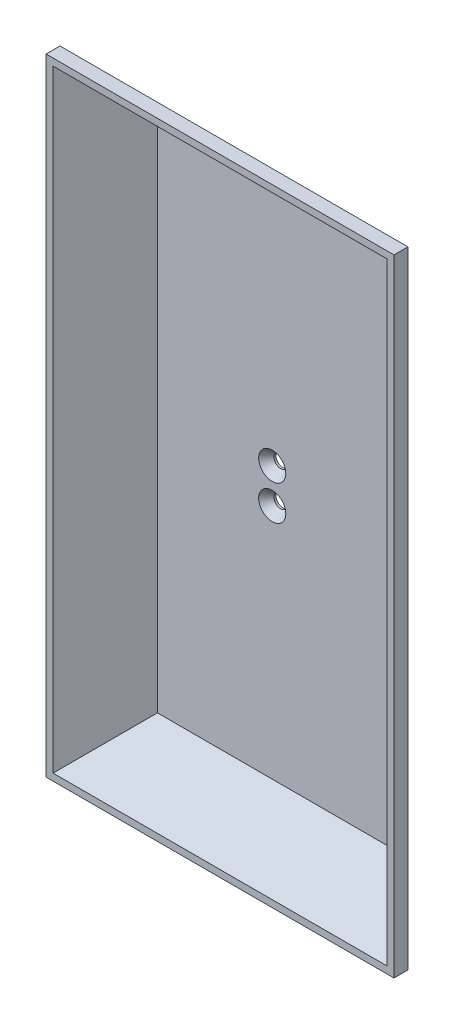
ISO-10303-21;
HEADER;
FILE_DESCRIPTION(('STEP AP214'),'2;1');
FILE_NAME('part.step','',(''),(''),'','','');
FILE_SCHEMA(('AUTOMOTIVE_DESIGN { 1 0 10303 214 1 1 1 1 }'));
ENDSEC;
DATA;
#1=APPLICATION_CONTEXT('core data for automotive mechanical design processes');
#2=APPLICATION_PROTOCOL_DEFINITION('international standard','automotive_design',2000,#1);
#3=PRODUCT_CONTEXT('',#1,'mechanical');
#4=PRODUCT('Part','Part','',(#3));
#5=PRODUCT_RELATED_PRODUCT_CATEGORY('part','',(#4));
#6=PRODUCT_DEFINITION_FORMATION('','',#4);
#7=PRODUCT_DEFINITION_CONTEXT('part definition',#1,'design');
#8=PRODUCT_DEFINITION('design','',#6,#7);
#9=PRODUCT_DEFINITION_SHAPE('','',#8);
#10=(LENGTH_UNIT() NAMED_UNIT(*) SI_UNIT(.MILLI.,.METRE.));
#11=(NAMED_UNIT(*) PLANE_ANGLE_UNIT() SI_UNIT($,.RADIAN.));
#12=(NAMED_UNIT(*) SI_UNIT($,.STERADIAN.) SOLID_ANGLE_UNIT());
#13=UNCERTAINTY_MEASURE_WITH_UNIT(LENGTH_MEASURE(1.E-05),#10,'distance_accuracy_value','');
#14=(GEOMETRIC_REPRESENTATION_CONTEXT(3) GLOBAL_UNCERTAINTY_ASSIGNED_CONTEXT((#13)) GLOBAL_UNIT_ASSIGNED_CONTEXT((#10,
#11,#12)) REPRESENTATION_CONTEXT('',''));
#15=CARTESIAN_POINT('',(0.,0.,0.));
#16=DIRECTION('',(0.,0.,1.));
#17=DIRECTION('',(1.,0.,0.));
#18=AXIS2_PLACEMENT_3D('',#15,#16,#17);
#19=CARTESIAN_POINT('',(0.,-5.,-1.2E-05));
#20=DIRECTION('',(0.,0.,1.));
#21=DIRECTION('',(1.,0.,0.));
#22=AXIS2_PLACEMENT_3D('',#19,#20,#21);
#23=CYLINDRICAL_SURFACE('',#22,1.9);
#24=CARTESIAN_POINT('',(0.,-5.,1.59999999999993));
#25=DIRECTION('',(0.,0.,1.));
#26=DIRECTION('',(1.,0.,0.));
#27=AXIS2_PLACEMENT_3D('',#24,#25,#26);
#28=CIRCLE('',#27,1.9);
#29=CARTESIAN_POINT('',(1.9,-5.,1.59999999999993));
#30=VERTEX_POINT('',#29);
#31=EDGE_CURVE('E11',#30,#30,#28,.T.);
#32=CARTESIAN_POINT('',(0.,-5.,1.));
#33=DIRECTION('',(0.,0.,-1.));
#34=DIRECTION('',(-1.,0.,0.));
#35=AXIS2_PLACEMENT_3D('',#32,#33,#34);
#36=CIRCLE('',#35,1.9);
#37=CARTESIAN_POINT('',(1.9,-5.,1.));
#38=VERTEX_POINT('',#37);
#39=EDGE_CURVE('E181',#38,#38,#36,.F.);
#40=CARTESIAN_POINT('',(1.9,-5.,1.59999999999993));
#41=CARTESIAN_POINT('',(1.9,-5.,1.59374999999993));
#42=CARTESIAN_POINT('',(1.9,-5.,1.58749999999994));
#43=CARTESIAN_POINT('',(1.9,-5.,1.57499999999994));
#44=CARTESIAN_POINT('',(1.9,-5.,1.56874999999994));
#45=CARTESIAN_POINT('',(1.9,-5.,1.55624999999994));
#46=CARTESIAN_POINT('',(1.9,-5.,1.54999999999994));
#47=CARTESIAN_POINT('',(1.9,-5.,1.53749999999994));
#48=CARTESIAN_POINT('',(1.9,-5.,1.53124999999994));
#49=CARTESIAN_POINT('',(1.9,-5.,1.51874999999994));
#50=CARTESIAN_POINT('',(1.9,-5.,1.51249999999994));
#51=CARTESIAN_POINT('',(1.9,-5.,1.49999999999994));
#52=CARTESIAN_POINT('',(1.9,-5.,1.49374999999995));
#53=CARTESIAN_POINT('',(1.9,-5.,1.48124999999995));
#54=CARTESIAN_POINT('',(1.9,-5.,1.47499999999995));
#55=CARTESIAN_POINT('',(1.9,-5.,1.46249999999995));
#56=CARTESIAN_POINT('',(1.9,-5.,1.45624999999995));
#57=CARTESIAN_POINT('',(1.9,-5.,1.44374999999995));
#58=CARTESIAN_POINT('',(1.9,-5.,1.43749999999995));
#59=CARTESIAN_POINT('',(1.9,-5.,1.42499999999995));
#60=CARTESIAN_POINT('',(1.9,-5.,1.41874999999995));
#61=CARTESIAN_POINT('',(1.9,-5.,1.40624999999996));
#62=CARTESIAN_POINT('',(1.9,-5.,1.39999999999996));
#63=CARTESIAN_POINT('',(1.9,-5.,1.38749999999996));
#64=CARTESIAN_POINT('',(1.9,-5.,1.38124999999996));
#65=CARTESIAN_POINT('',(1.9,-5.,1.36874999999996));
#66=CARTESIAN_POINT('',(1.9,-5.,1.36249999999996));
#67=CARTESIAN_POINT('',(1.9,-5.,1.34999999999996));
#68=CARTESIAN_POINT('',(1.9,-5.,1.34374999999996));
#69=CARTESIAN_POINT('',(1.9,-5.,1.33124999999996));
#70=CARTESIAN_POINT('',(1.9,-5.,1.32499999999996));
#71=CARTESIAN_POINT('',(1.9,-5.,1.31249999999997));
#72=CARTESIAN_POINT('',(1.9,-5.,1.30624999999997));
#73=CARTESIAN_POINT('',(1.9,-5.,1.29374999999997));
#74=CARTESIAN_POINT('',(1.9,-5.,1.28749999999997));
#75=CARTESIAN_POINT('',(1.9,-5.,1.27499999999997));
#76=CARTESIAN_POINT('',(1.9,-5.,1.26874999999997));
#77=CARTESIAN_POINT('',(1.9,-5.,1.25624999999997));
#78=CARTESIAN_POINT('',(1.9,-5.,1.24999999999997));
#79=CARTESIAN_POINT('',(1.9,-5.,1.23749999999997));
#80=CARTESIAN_POINT('',(1.9,-5.,1.23124999999997));
#81=CARTESIAN_POINT('',(1.9,-5.,1.21874999999998));
#82=CARTESIAN_POINT('',(1.9,-5.,1.21249999999998));
#83=CARTESIAN_POINT('',(1.9,-5.,1.19999999999998));
#84=CARTESIAN_POINT('',(1.9,-5.,1.19374999999998));
#85=CARTESIAN_POINT('',(1.9,-5.,1.18124999999998));
#86=CARTESIAN_POINT('',(1.9,-5.,1.17499999999998));
#87=CARTESIAN_POINT('',(1.9,-5.,1.16249999999998));
#88=CARTESIAN_POINT('',(1.9,-5.,1.15624999999998));
#89=CARTESIAN_POINT('',(1.9,-5.,1.14374999999998));
#90=CARTESIAN_POINT('',(1.9,-5.,1.13749999999998));
#91=CARTESIAN_POINT('',(1.9,-5.,1.12499999999999));
#92=CARTESIAN_POINT('',(1.9,-5.,1.11874999999999));
#93=CARTESIAN_POINT('',(1.9,-5.,1.10624999999999));
#94=CARTESIAN_POINT('',(1.9,-5.,1.09999999999999));
#95=CARTESIAN_POINT('',(1.9,-5.,1.08749999999999));
#96=CARTESIAN_POINT('',(1.9,-5.,1.08124999999999));
#97=CARTESIAN_POINT('',(1.9,-5.,1.06874999999999));
#98=CARTESIAN_POINT('',(1.9,-5.,1.06249999999999));
#99=CARTESIAN_POINT('',(1.9,-5.,1.04999999999999));
#100=CARTESIAN_POINT('',(1.9,-5.,1.04375));
#101=CARTESIAN_POINT('',(1.9,-5.,1.03125));
#102=CARTESIAN_POINT('',(1.9,-5.,1.025));
#103=CARTESIAN_POINT('',(1.9,-5.,1.0125));
#104=CARTESIAN_POINT('',(1.9,-5.,1.00625));
#105=CARTESIAN_POINT('',(1.9,-5.,1.));
#106=B_SPLINE_CURVE_WITH_KNOTS('',3,(#40,#41,#42,#43,#44,#45,#46,#47,#48,#49,#50,#51,#52,#53,
#54,#55,#56,#57,#58,#59,#60,#61,#62,#63,#64,#65,#66,#67,#68,#69,#70,#71,#72,#73,#74,#75,#76,#77,
#78,#79,#80,#81,#82,#83,#84,#85,#86,#87,#88,#89,#90,#91,#92,#93,#94,#95,#96,#97,#98,#99,#100,
#101,#102,#103,#104,#105),.UNSPECIFIED.,.F.,.F.,(4,2,2,2,2,2,2,2,2,2,2,2,2,2,2,2,2,2,2,2,2,2,2,
2,2,2,2,2,2,2,2,2,4),(0.,0.0187499999999979,0.0374999999999959,0.0562499999999938,
0.0749999999999917,0.0937499999999897,0.112499999999988,0.131249999999986,0.149999999999983,
0.168749999999981,0.187499999999979,0.206249999999977,0.224999999999975,0.243749999999973,
0.262499999999971,0.281249999999969,0.299999999999967,0.318749999999965,0.337499999999963,
0.356249999999961,0.374999999999959,0.393749999999957,0.412499999999955,0.431249999999953,
0.44999999999995,0.468749999999948,0.487499999999946,0.506249999999944,0.524999999999942,
0.54374999999994,0.562499999999938,0.581249999999936,0.599999999999934),.UNSPECIFIED.);
#107=EDGE_CURVE('BSEAM38',#30,#38,#106,.T.);
#108=ORIENTED_EDGE('',*,*,#31,.T.);
#109=ORIENTED_EDGE('',*,*,#39,.F.);
#110=ORIENTED_EDGE('',*,*,#107,.T.);
#111=ORIENTED_EDGE('',*,*,#107,.F.);
#112=EDGE_LOOP('',(#108,#110,#109,#111));
#113=FACE_BOUND('',#112,.T.);
#114=ADVANCED_FACE('F38',(#113),#23,.F.);
#115=CARTESIAN_POINT('',(0.,5.,-1.2E-05));
#116=DIRECTION('',(0.,0.,1.));
#117=DIRECTION('',(1.,0.,0.));
#118=AXIS2_PLACEMENT_3D('',#115,#116,#117);
#119=CYLINDRICAL_SURFACE('',#118,1.9);
#120=CARTESIAN_POINT('',(0.,5.,1.59999999999993));
#121=DIRECTION('',(0.,0.,1.));
#122=DIRECTION('',(1.,0.,0.));
#123=AXIS2_PLACEMENT_3D('',#120,#121,#122);
#124=CIRCLE('',#123,1.9);
#125=CARTESIAN_POINT('',(1.9,5.,1.59999999999993));
#126=VERTEX_POINT('',#125);
#127=EDGE_CURVE('E246',#126,#126,#124,.T.);
#128=CARTESIAN_POINT('',(0.,5.,1.));
#129=DIRECTION('',(0.,0.,-1.));
#130=DIRECTION('',(-1.,0.,0.));
#131=AXIS2_PLACEMENT_3D('',#128,#129,#130);
#132=CIRCLE('',#131,1.9);
#133=CARTESIAN_POINT('',(1.9,5.,1.));
#134=VERTEX_POINT('',#133);
#135=EDGE_CURVE('E43',#134,#134,#132,.F.);
#136=CARTESIAN_POINT('',(1.9,5.,1.59999999999993));
#137=CARTESIAN_POINT('',(1.9,5.,1.59374999999993));
#138=CARTESIAN_POINT('',(1.9,5.,1.58749999999993));
#139=CARTESIAN_POINT('',(1.9,5.,1.57499999999994));
#140=CARTESIAN_POINT('',(1.9,5.,1.56874999999994));
#141=CARTESIAN_POINT('',(1.9,5.,1.55624999999994));
#142=CARTESIAN_POINT('',(1.9,5.,1.54999999999994));
#143=CARTESIAN_POINT('',(1.9,5.,1.53749999999994));
#144=CARTESIAN_POINT('',(1.9,5.,1.53124999999994));
#145=CARTESIAN_POINT('',(1.9,5.,1.51874999999994));
#146=CARTESIAN_POINT('',(1.9,5.,1.51249999999994));
#147=CARTESIAN_POINT('',(1.9,5.,1.49999999999994));
#148=CARTESIAN_POINT('',(1.9,5.,1.49374999999995));
#149=CARTESIAN_POINT('',(1.9,5.,1.48124999999995));
#150=CARTESIAN_POINT('',(1.9,5.,1.47499999999995));
#151=CARTESIAN_POINT('',(1.9,5.,1.46249999999995));
#152=CARTESIAN_POINT('',(1.9,5.,1.45624999999995));
#153=CARTESIAN_POINT('',(1.9,5.,1.44374999999995));
#154=CARTESIAN_POINT('',(1.9,5.,1.43749999999995));
#155=CARTESIAN_POINT('',(1.9,5.,1.42499999999995));
#156=CARTESIAN_POINT('',(1.9,5.,1.41874999999995));
#157=CARTESIAN_POINT('',(1.9,5.,1.40624999999995));
#158=CARTESIAN_POINT('',(1.9,5.,1.39999999999996));
#159=CARTESIAN_POINT('',(1.9,5.,1.38749999999996));
#160=CARTESIAN_POINT('',(1.9,5.,1.38124999999996));
#161=CARTESIAN_POINT('',(1.9,5.,1.36874999999996));
#162=CARTESIAN_POINT('',(1.9,5.,1.36249999999996));
#163=CARTESIAN_POINT('',(1.9,5.,1.34999999999996));
#164=CARTESIAN_POINT('',(1.9,5.,1.34374999999996));
#165=CARTESIAN_POINT('',(1.9,5.,1.33124999999996));
#166=CARTESIAN_POINT('',(1.9,5.,1.32499999999996));
#167=CARTESIAN_POINT('',(1.9,5.,1.31249999999997));
#168=CARTESIAN_POINT('',(1.9,5.,1.30624999999997));
#169=CARTESIAN_POINT('',(1.9,5.,1.29374999999997));
#170=CARTESIAN_POINT('',(1.9,5.,1.28749999999997));
#171=CARTESIAN_POINT('',(1.9,5.,1.27499999999997));
#172=CARTESIAN_POINT('',(1.9,5.,1.26874999999997));
#173=CARTESIAN_POINT('',(1.9,5.,1.25624999999997));
#174=CARTESIAN_POINT('',(1.9,5.,1.24999999999997));
#175=CARTESIAN_POINT('',(1.9,5.,1.23749999999997));
#176=CARTESIAN_POINT('',(1.9,5.,1.23124999999997));
#177=CARTESIAN_POINT('',(1.9,5.,1.21874999999998));
#178=CARTESIAN_POINT('',(1.9,5.,1.21249999999998));
#179=CARTESIAN_POINT('',(1.9,5.,1.19999999999998));
#180=CARTESIAN_POINT('',(1.9,5.,1.19374999999998));
#181=CARTESIAN_POINT('',(1.9,5.,1.18124999999998));
#182=CARTESIAN_POINT('',(1.9,5.,1.17499999999998));
#183=CARTESIAN_POINT('',(1.9,5.,1.16249999999998));
#184=CARTESIAN_POINT('',(1.9,5.,1.15624999999998));
#185=CARTESIAN_POINT('',(1.9,5.,1.14374999999998));
#186=CARTESIAN_POINT('',(1.9,5.,1.13749999999998));
#187=CARTESIAN_POINT('',(1.9,5.,1.12499999999999));
#188=CARTESIAN_POINT('',(1.9,5.,1.11874999999999));
#189=CARTESIAN_POINT('',(1.9,5.,1.10624999999999));
#190=CARTESIAN_POINT('',(1.9,5.,1.09999999999999));
#191=CARTESIAN_POINT('',(1.9,5.,1.08749999999999));
#192=CARTESIAN_POINT('',(1.9,5.,1.08124999999999));
#193=CARTESIAN_POINT('',(1.9,5.,1.06874999999999));
#194=CARTESIAN_POINT('',(1.9,5.,1.06249999999999));
#195=CARTESIAN_POINT('',(1.9,5.,1.04999999999999));
#196=CARTESIAN_POINT('',(1.9,5.,1.04375));
#197=CARTESIAN_POINT('',(1.9,5.,1.03125));
#198=CARTESIAN_POINT('',(1.9,5.,1.025));
#199=CARTESIAN_POINT('',(1.9,5.,1.0125));
#200=CARTESIAN_POINT('',(1.9,5.,1.00625));
#201=CARTESIAN_POINT('',(1.9,5.,1.));
#202=B_SPLINE_CURVE_WITH_KNOTS('',3,(#136,#137,#138,#139,#140,#141,#142,#143,#144,#145,#146,
#147,#148,#149,#150,#151,#152,#153,#154,#155,#156,#157,#158,#159,#160,#161,#162,#163,#164,#165,
#166,#167,#168,#169,#170,#171,#172,#173,#174,#175,#176,#177,#178,#179,#180,#181,#182,#183,#184,
#185,#186,#187,#188,#189,#190,#191,#192,#193,#194,#195,#196,#197,#198,#199,#200,#201),
.UNSPECIFIED.,.F.,.F.,(4,2,2,2,2,2,2,2,2,2,2,2,2,2,2,2,2,2,2,2,2,2,2,2,2,2,2,2,2,2,2,2,4),(0.,
0.0187499999999979,0.0374999999999959,0.0562499999999938,0.0749999999999917,0.0937499999999895,
0.112499999999987,0.131249999999985,0.149999999999983,0.168749999999981,0.187499999999979,
0.206249999999977,0.224999999999975,0.243749999999973,0.262499999999971,0.281249999999969,
0.299999999999967,0.318749999999964,0.337499999999962,0.35624999999996,0.374999999999958,
0.393749999999956,0.412499999999954,0.431249999999952,0.44999999999995,0.468749999999948,
0.487499999999946,0.506249999999943,0.524999999999941,0.543749999999939,0.562499999999937,
0.581249999999935,0.599999999999933),.UNSPECIFIED.);
#203=EDGE_CURVE('BSEAM282',#126,#134,#202,.T.);
#204=ORIENTED_EDGE('',*,*,#127,.T.);
#205=ORIENTED_EDGE('',*,*,#135,.F.);
#206=ORIENTED_EDGE('',*,*,#203,.T.);
#207=ORIENTED_EDGE('',*,*,#203,.F.);
#208=EDGE_LOOP('',(#204,#206,#205,#207));
#209=FACE_BOUND('',#208,.T.);
#210=ADVANCED_FACE('F282',(#209),#119,.F.);
#211=CARTESIAN_POINT('',(50.,90.,4.));
#212=DIRECTION('',(-1.,0.,0.));
#213=DIRECTION('',(0.,-1.,0.));
#214=AXIS2_PLACEMENT_3D('',#211,#212,#213);
#215=PLANE('',#214);
#216=DIRECTION('',(0.,0.,-1.));
#217=VECTOR('',#216,1.);
#218=CARTESIAN_POINT('',(50.,-90.,4.));
#219=LINE('',#218,#217);
#220=CARTESIAN_POINT('',(50.,-90.,19.));
#221=VERTEX_POINT('',#220);
#222=CARTESIAN_POINT('',(50.,-90.,15.));
#223=VERTEX_POINT('',#222);
#224=EDGE_CURVE('E210',#221,#223,#219,.T.);
#225=ORIENTED_EDGE('',*,*,#224,.T.);
#226=DIRECTION('',(0.,1.,0.));
#227=VECTOR('',#226,1.);
#228=CARTESIAN_POINT('',(50.,90.,15.));
#229=LINE('',#228,#227);
#230=CARTESIAN_POINT('',(50.,90.,15.));
#231=VERTEX_POINT('',#230);
#232=EDGE_CURVE('E241',#223,#231,#229,.T.);
#233=ORIENTED_EDGE('',*,*,#232,.T.);
#234=DIRECTION('',(0.,0.,-1.));
#235=VECTOR('',#234,1.);
#236=CARTESIAN_POINT('',(50.,90.,4.));
#237=LINE('',#236,#235);
#238=CARTESIAN_POINT('',(50.,90.,19.));
#239=VERTEX_POINT('',#238);
#240=EDGE_CURVE('E217',#239,#231,#237,.T.);
#241=ORIENTED_EDGE('',*,*,#240,.F.);
#242=DIRECTION('',(0.,1.,0.));
#243=VECTOR('',#242,1.);
#244=CARTESIAN_POINT('',(50.,90.,19.));
#245=LINE('',#244,#243);
#246=EDGE_CURVE('E198',#221,#239,#245,.T.);
#247=ORIENTED_EDGE('',*,*,#246,.F.);
#248=EDGE_LOOP('',(#225,#233,#241,#247));
#249=FACE_BOUND('',#248,.T.);
#250=ADVANCED_FACE('F285',(#249),#215,.F.);
#251=CARTESIAN_POINT('',(-50.,90.,4.));
#252=DIRECTION('',(0.,-1.,0.));
#253=DIRECTION('',(0.,0.,-1.));
#254=AXIS2_PLACEMENT_3D('',#251,#252,#253);
#255=PLANE('',#254);
#256=ORIENTED_EDGE('',*,*,#240,.T.);
#257=DIRECTION('',(-1.,0.,0.));
#258=VECTOR('',#257,1.);
#259=CARTESIAN_POINT('',(-50.,90.,15.));
#260=LINE('',#259,#258);
#261=CARTESIAN_POINT('',(-50.,90.,15.));
#262=VERTEX_POINT('',#261);
#263=EDGE_CURVE('E229',#231,#262,#260,.T.);
#264=ORIENTED_EDGE('',*,*,#263,.T.);
#265=DIRECTION('',(0.,0.,-1.));
#266=VECTOR('',#265,1.);
#267=CARTESIAN_POINT('',(-50.,90.,4.));
#268=LINE('',#267,#266);
#269=CARTESIAN_POINT('',(-50.,90.,19.));
#270=VERTEX_POINT('',#269);
#271=EDGE_CURVE('E215',#270,#262,#268,.T.);
#272=ORIENTED_EDGE('',*,*,#271,.F.);
#273=DIRECTION('',(-1.,0.,0.));
#274=VECTOR('',#273,1.);
#275=CARTESIAN_POINT('',(-50.,90.,19.));
#276=LINE('',#275,#274);
#277=EDGE_CURVE('E201',#239,#270,#276,.T.);
#278=ORIENTED_EDGE('',*,*,#277,.F.);
#279=EDGE_LOOP('',(#256,#264,#272,#278));
#280=FACE_BOUND('',#279,.T.);
#281=ADVANCED_FACE('F319',(#280),#255,.F.);
#282=CARTESIAN_POINT('',(-50.,90.,4.));
#283=DIRECTION('',(1.,0.,0.));
#284=DIRECTION('',(0.,1.,0.));
#285=AXIS2_PLACEMENT_3D('',#282,#283,#284);
#286=PLANE('',#285);
#287=ORIENTED_EDGE('',*,*,#271,.T.);
#288=DIRECTION('',(0.,-1.,0.));
#289=VECTOR('',#288,1.);
#290=CARTESIAN_POINT('',(-50.,90.,15.));
#291=LINE('',#290,#289);
#292=CARTESIAN_POINT('',(-50.,-90.,15.));
#293=VERTEX_POINT('',#292);
#294=EDGE_CURVE('E63',#262,#293,#291,.T.);
#295=ORIENTED_EDGE('',*,*,#294,.T.);
#296=DIRECTION('',(0.,0.,-1.));
#297=VECTOR('',#296,1.);
#298=CARTESIAN_POINT('',(-50.,-90.,4.));
#299=LINE('',#298,#297);
#300=CARTESIAN_POINT('',(-50.,-90.,19.));
#301=VERTEX_POINT('',#300);
#302=EDGE_CURVE('E213',#301,#293,#299,.T.);
#303=ORIENTED_EDGE('',*,*,#302,.F.);
#304=DIRECTION('',(0.,-1.,0.));
#305=VECTOR('',#304,1.);
#306=CARTESIAN_POINT('',(-50.,90.,19.));
#307=LINE('',#306,#305);
#308=EDGE_CURVE('E204',#270,#301,#307,.T.);
#309=ORIENTED_EDGE('',*,*,#308,.F.);
#310=EDGE_LOOP('',(#287,#295,#303,#309));
#311=FACE_BOUND('',#310,.T.);
#312=ADVANCED_FACE('F315',(#311),#286,.F.);
#313=CARTESIAN_POINT('',(-50.,-90.,4.));
#314=DIRECTION('',(0.,1.,0.));
#315=DIRECTION('',(0.,0.,1.));
#316=AXIS2_PLACEMENT_3D('',#313,#314,#315);
#317=PLANE('',#316);
#318=ORIENTED_EDGE('',*,*,#302,.T.);
#319=DIRECTION('',(1.,0.,0.));
#320=VECTOR('',#319,1.);
#321=CARTESIAN_POINT('',(-50.,-90.,15.));
#322=LINE('',#321,#320);
#323=EDGE_CURVE('E244',#293,#223,#322,.T.);
#324=ORIENTED_EDGE('',*,*,#323,.T.);
#325=ORIENTED_EDGE('',*,*,#224,.F.);
#326=DIRECTION('',(1.,0.,0.));
#327=VECTOR('',#326,1.);
#328=CARTESIAN_POINT('',(-50.,-90.,19.));
#329=LINE('',#328,#327);
#330=EDGE_CURVE('E207',#301,#221,#329,.T.);
#331=ORIENTED_EDGE('',*,*,#330,.F.);
#332=EDGE_LOOP('',(#318,#324,#325,#331));
#333=FACE_BOUND('',#332,.T.);
#334=ADVANCED_FACE('F311',(#333),#317,.F.);
#335=CARTESIAN_POINT('',(0.,0.,0.));
#336=DIRECTION('',(0.,0.,1.));
#337=DIRECTION('',(1.,0.,0.));
#338=AXIS2_PLACEMENT_3D('',#335,#336,#337);
#339=PLANE('',#338);
#340=DIRECTION('',(1.,0.,0.));
#341=VECTOR('',#340,1.);
#342=CARTESIAN_POINT('',(6.1,11.15,0.));
#343=LINE('',#342,#341);
#344=CARTESIAN_POINT('',(-6.1,11.15,0.));
#345=VERTEX_POINT('',#344);
#346=CARTESIAN_POINT('',(6.1,11.15,0.));
#347=VERTEX_POINT('',#346);
#348=EDGE_CURVE('E172',#345,#347,#343,.T.);
#349=ORIENTED_EDGE('',*,*,#348,.F.);
#350=DIRECTION('',(0.,1.,0.));
#351=VECTOR('',#350,1.);
#352=CARTESIAN_POINT('',(-6.1,11.15,0.));
#353=LINE('',#352,#351);
#354=CARTESIAN_POINT('',(-6.1,-11.15,0.));
#355=VERTEX_POINT('',#354);
#356=EDGE_CURVE('E55',#355,#345,#353,.T.);
#357=ORIENTED_EDGE('',*,*,#356,.F.);
#358=DIRECTION('',(-1.,0.,0.));
#359=VECTOR('',#358,1.);
#360=CARTESIAN_POINT('',(6.1,-11.15,0.));
#361=LINE('',#360,#359);
#362=CARTESIAN_POINT('',(6.1,-11.15,0.));
#363=VERTEX_POINT('',#362);
#364=EDGE_CURVE('E163',#363,#355,#361,.T.);
#365=ORIENTED_EDGE('',*,*,#364,.F.);
#366=DIRECTION('',(0.,-1.,0.));
#367=VECTOR('',#366,1.);
#368=CARTESIAN_POINT('',(6.1,11.15,0.));
#369=LINE('',#368,#367);
#370=EDGE_CURVE('E166',#347,#363,#369,.T.);
#371=ORIENTED_EDGE('',*,*,#370,.F.);
#372=EDGE_LOOP('',(#349,#357,#365,#371));
#373=FACE_BOUND('',#372,.T.);
#374=DIRECTION('',(0.,1.,0.));
#375=VECTOR('',#374,1.);
#376=CARTESIAN_POINT('',(-34.9999999999999,0.,0.));
#377=LINE('',#376,#375);
#378=CARTESIAN_POINT('',(-34.9999999999999,-74.9999999999999,0.));
#379=VERTEX_POINT('',#378);
#380=CARTESIAN_POINT('',(-34.9999999999999,75.,0.));
#381=VERTEX_POINT('',#380);
#382=EDGE_CURVE('E234',#379,#381,#377,.T.);
#383=ORIENTED_EDGE('',*,*,#382,.T.);
#384=DIRECTION('',(1.,0.,0.));
#385=VECTOR('',#384,1.);
#386=CARTESIAN_POINT('',(0.,75.,0.));
#387=LINE('',#386,#385);
#388=CARTESIAN_POINT('',(34.9999999999999,75.,0.));
#389=VERTEX_POINT('',#388);
#390=EDGE_CURVE('E238',#381,#389,#387,.T.);
#391=ORIENTED_EDGE('',*,*,#390,.T.);
#392=DIRECTION('',(0.,-1.,0.));
#393=VECTOR('',#392,1.);
#394=CARTESIAN_POINT('',(34.9999999999999,0.,0.));
#395=LINE('',#394,#393);
#396=CARTESIAN_POINT('',(35.,-74.9999999999999,0.));
#397=VERTEX_POINT('',#396);
#398=EDGE_CURVE('E236',#389,#397,#395,.T.);
#399=ORIENTED_EDGE('',*,*,#398,.T.);
#400=DIRECTION('',(-1.,0.,0.));
#401=VECTOR('',#400,1.);
#402=CARTESIAN_POINT('',(0.,-74.9999999999999,0.));
#403=LINE('',#402,#401);
#404=EDGE_CURVE('E232',#397,#379,#403,.T.);
#405=ORIENTED_EDGE('',*,*,#404,.T.);
#406=EDGE_LOOP('',(#383,#391,#399,#405));
#407=FACE_BOUND('',#406,.T.);
#408=ADVANCED_FACE('F304',(#373,#407),#339,.F.);
#409=CARTESIAN_POINT('',(0.,0.,19.));
#410=DIRECTION('',(0.,0.,1.));
#411=DIRECTION('',(1.,0.,0.));
#412=AXIS2_PLACEMENT_3D('',#409,#410,#411);
#413=PLANE('',#412);
#414=ORIENTED_EDGE('',*,*,#246,.T.);
#415=ORIENTED_EDGE('',*,*,#277,.T.);
#416=ORIENTED_EDGE('',*,*,#308,.T.);
#417=ORIENTED_EDGE('',*,*,#330,.T.);
#418=EDGE_LOOP('',(#414,#415,#416,#417));
#419=FACE_BOUND('',#418,.T.);
#420=DIRECTION('',(-1.,0.,0.));
#421=VECTOR('',#420,1.);
#422=CARTESIAN_POINT('',(-48.,87.9999999999999,19.));
#423=LINE('',#422,#421);
#424=CARTESIAN_POINT('',(48.,87.9999999999999,19.));
#425=VERTEX_POINT('',#424);
#426=CARTESIAN_POINT('',(-48.,87.9999999999999,19.));
#427=VERTEX_POINT('',#426);
#428=EDGE_CURVE('E188',#425,#427,#423,.T.);
#429=ORIENTED_EDGE('',*,*,#428,.F.);
#430=DIRECTION('',(0.,1.,0.));
#431=VECTOR('',#430,1.);
#432=CARTESIAN_POINT('',(48.,87.9999999999999,19.));
#433=LINE('',#432,#431);
#434=CARTESIAN_POINT('',(48.,-88.,19.));
#435=VERTEX_POINT('',#434);
#436=EDGE_CURVE('E185',#435,#425,#433,.T.);
#437=ORIENTED_EDGE('',*,*,#436,.F.);
#438=DIRECTION('',(1.,0.,0.));
#439=VECTOR('',#438,1.);
#440=CARTESIAN_POINT('',(-48.,-88.,19.));
#441=LINE('',#440,#439);
#442=CARTESIAN_POINT('',(-48.,-88.,19.));
#443=VERTEX_POINT('',#442);
#444=EDGE_CURVE('E195',#443,#435,#441,.T.);
#445=ORIENTED_EDGE('',*,*,#444,.F.);
#446=DIRECTION('',(0.,-1.,0.));
#447=VECTOR('',#446,1.);
#448=CARTESIAN_POINT('',(-48.,87.9999999999999,19.));
#449=LINE('',#448,#447);
#450=EDGE_CURVE('E192',#427,#443,#449,.T.);
#451=ORIENTED_EDGE('',*,*,#450,.F.);
#452=EDGE_LOOP('',(#429,#437,#445,#451));
#453=FACE_BOUND('',#452,.T.);
#454=ADVANCED_FACE('F301',(#419,#453),#413,.T.);
#455=CARTESIAN_POINT('',(0.,0.,4.));
#456=DIRECTION('',(0.,0.,1.));
#457=DIRECTION('',(1.,0.,0.));
#458=AXIS2_PLACEMENT_3D('',#455,#456,#457);
#459=PLANE('',#458);
#460=CARTESIAN_POINT('',(0.,5.,4.));
#461=DIRECTION('',(0.,0.,1.));
#462=DIRECTION('',(1.,0.,0.));
#463=AXIS2_PLACEMENT_3D('',#460,#461,#462);
#464=CIRCLE('',#463,3.90000000000007);
#465=CARTESIAN_POINT('',(3.90000000000007,5.,4.));
#466=VERTEX_POINT('',#465);
#467=EDGE_CURVE('E48',#466,#466,#464,.F.);
#468=ORIENTED_EDGE('',*,*,#467,.T.);
#469=EDGE_LOOP('',(#468));
#470=FACE_BOUND('',#469,.T.);
#471=CARTESIAN_POINT('',(0.,-5.,4.));
#472=DIRECTION('',(0.,0.,1.));
#473=DIRECTION('',(1.,0.,0.));
#474=AXIS2_PLACEMENT_3D('',#471,#472,#473);
#475=CIRCLE('',#474,3.90000000000007);
#476=CARTESIAN_POINT('',(3.90000000000007,-5.,4.));
#477=VERTEX_POINT('',#476);
#478=EDGE_CURVE('E267',#477,#477,#475,.F.);
#479=ORIENTED_EDGE('',*,*,#478,.T.);
#480=EDGE_LOOP('',(#479));
#481=FACE_BOUND('',#480,.T.);
#482=DIRECTION('',(0.,-1.,0.));
#483=VECTOR('',#482,1.);
#484=CARTESIAN_POINT('',(-32.9999999999999,-88.,4.));
#485=LINE('',#484,#483);
#486=CARTESIAN_POINT('',(-32.9999999999999,72.9999999999998,4.));
#487=VERTEX_POINT('',#486);
#488=CARTESIAN_POINT('',(-32.9999999999999,-72.9999999999999,4.));
#489=VERTEX_POINT('',#488);
#490=EDGE_CURVE('E220',#487,#489,#485,.T.);
#491=ORIENTED_EDGE('',*,*,#490,.T.);
#492=DIRECTION('',(1.,0.,0.));
#493=VECTOR('',#492,1.);
#494=CARTESIAN_POINT('',(48.,-72.9999999999999,4.));
#495=LINE('',#494,#493);
#496=CARTESIAN_POINT('',(32.9999999999999,-72.9999999999999,4.));
#497=VERTEX_POINT('',#496);
#498=EDGE_CURVE('E226',#489,#497,#495,.T.);
#499=ORIENTED_EDGE('',*,*,#498,.T.);
#500=DIRECTION('',(0.,1.,0.));
#501=VECTOR('',#500,1.);
#502=CARTESIAN_POINT('',(32.9999999999999,87.9999999999999,4.));
#503=LINE('',#502,#501);
#504=CARTESIAN_POINT('',(32.9999999999999,72.9999999999998,4.));
#505=VERTEX_POINT('',#504);
#506=EDGE_CURVE('E224',#497,#505,#503,.T.);
#507=ORIENTED_EDGE('',*,*,#506,.T.);
#508=DIRECTION('',(-1.,0.,0.));
#509=VECTOR('',#508,1.);
#510=CARTESIAN_POINT('',(-48.,72.9999999999998,4.));
#511=LINE('',#510,#509);
#512=EDGE_CURVE('E222',#505,#487,#511,.T.);
#513=ORIENTED_EDGE('',*,*,#512,.T.);
#514=EDGE_LOOP('',(#491,#499,#507,#513));
#515=FACE_BOUND('',#514,.T.);
#516=ADVANCED_FACE('F273',(#470,#481,#515),#459,.T.);
#517=CARTESIAN_POINT('',(0.,72.9999999999998,4.));
#518=DIRECTION('',(0.,-0.707106781186545,0.70710678118655));
#519=DIRECTION('',(1.,0.,0.));
#520=AXIS2_PLACEMENT_3D('',#517,#518,#519);
#521=PLANE('',#520);
#522=DIRECTION('',(0.577350269189627,0.577350269189627,0.577350269189623));
#523=VECTOR('',#522,1.);
#524=CARTESIAN_POINT('',(8.66666666666654,48.6666666666665,-20.3333333333332));
#525=LINE('',#524,#523);
#526=EDGE_CURVE('E252',#425,#505,#525,.F.);
#527=ORIENTED_EDGE('',*,*,#526,.F.);
#528=ORIENTED_EDGE('',*,*,#428,.T.);
#529=DIRECTION('',(-0.577350269189627,0.577350269189627,0.577350269189623));
#530=VECTOR('',#529,1.);
#531=CARTESIAN_POINT('',(-21.9999999999999,61.9999999999998,-6.99999999999995));
#532=LINE('',#531,#530);
#533=EDGE_CURVE('E189',#487,#427,#532,.T.);
#534=ORIENTED_EDGE('',*,*,#533,.F.);
#535=ORIENTED_EDGE('',*,*,#512,.F.);
#536=EDGE_LOOP('',(#527,#528,#534,#535));
#537=FACE_BOUND('',#536,.T.);
#538=ADVANCED_FACE('F308',(#537),#521,.T.);
#539=CARTESIAN_POINT('',(-32.9999999999999,0.,4.));
#540=DIRECTION('',(0.707106781186545,0.,0.70710678118655));
#541=DIRECTION('',(0.,1.,0.));
#542=AXIS2_PLACEMENT_3D('',#539,#540,#541);
#543=PLANE('',#542);
#544=ORIENTED_EDGE('',*,*,#533,.T.);
#545=ORIENTED_EDGE('',*,*,#450,.T.);
#546=DIRECTION('',(0.577350269189627,0.577350269189627,-0.577350269189623));
#547=VECTOR('',#546,1.);
#548=CARTESIAN_POINT('',(-21.9999999999999,-61.9999999999999,-6.99999999999995));
#549=LINE('',#548,#547);
#550=EDGE_CURVE('E249',#489,#443,#549,.F.);
#551=ORIENTED_EDGE('',*,*,#550,.F.);
#552=ORIENTED_EDGE('',*,*,#490,.F.);
#553=EDGE_LOOP('',(#544,#545,#551,#552));
#554=FACE_BOUND('',#553,.T.);
#555=ADVANCED_FACE('F342',(#554),#543,.T.);
#556=CARTESIAN_POINT('',(32.9999999999999,0.,4.));
#557=DIRECTION('',(-0.707106781186545,0.,0.70710678118655));
#558=DIRECTION('',(0.,-1.,0.));
#559=AXIS2_PLACEMENT_3D('',#556,#557,#558);
#560=PLANE('',#559);
#561=ORIENTED_EDGE('',*,*,#526,.T.);
#562=ORIENTED_EDGE('',*,*,#506,.F.);
#563=DIRECTION('',(0.577350269189627,-0.577350269189627,0.577350269189623));
#564=VECTOR('',#563,1.);
#565=CARTESIAN_POINT('',(21.9999999999999,-61.9999999999998,-6.99999999999995));
#566=LINE('',#565,#564);
#567=EDGE_CURVE('E247',#435,#497,#566,.F.);
#568=ORIENTED_EDGE('',*,*,#567,.F.);
#569=ORIENTED_EDGE('',*,*,#436,.T.);
#570=EDGE_LOOP('',(#561,#562,#568,#569));
#571=FACE_BOUND('',#570,.T.);
#572=ADVANCED_FACE('F335',(#571),#560,.T.);
#573=CARTESIAN_POINT('',(0.,-72.9999999999999,4.));
#574=DIRECTION('',(0.,0.707106781186545,0.70710678118655));
#575=DIRECTION('',(-1.,0.,0.));
#576=AXIS2_PLACEMENT_3D('',#573,#574,#575);
#577=PLANE('',#576);
#578=ORIENTED_EDGE('',*,*,#550,.T.);
#579=ORIENTED_EDGE('',*,*,#444,.T.);
#580=ORIENTED_EDGE('',*,*,#567,.T.);
#581=ORIENTED_EDGE('',*,*,#498,.F.);
#582=EDGE_LOOP('',(#578,#579,#580,#581));
#583=FACE_BOUND('',#582,.T.);
#584=ADVANCED_FACE('F327',(#583),#577,.T.);
#585=CARTESIAN_POINT('',(-50.,-90.,15.));
#586=DIRECTION('',(0.,0.707106781186546,0.707106781186549));
#587=DIRECTION('',(1.,0.,0.));
#588=AXIS2_PLACEMENT_3D('',#585,#586,#587);
#589=PLANE('',#588);
#590=DIRECTION('',(0.577350269189627,0.577350269189627,-0.577350269189624));
#591=VECTOR('',#590,1.);
#592=CARTESIAN_POINT('',(-50.,-90.,15.));
#593=LINE('',#592,#591);
#594=EDGE_CURVE('E260',#379,#293,#593,.F.);
#595=ORIENTED_EDGE('',*,*,#594,.F.);
#596=ORIENTED_EDGE('',*,*,#404,.F.);
#597=DIRECTION('',(0.577350269189627,-0.577350269189627,0.577350269189624));
#598=VECTOR('',#597,1.);
#599=CARTESIAN_POINT('',(16.6666666666666,-56.6666666666665,-18.3333333333333));
#600=LINE('',#599,#598);
#601=EDGE_CURVE('E250',#223,#397,#600,.F.);
#602=ORIENTED_EDGE('',*,*,#601,.F.);
#603=ORIENTED_EDGE('',*,*,#323,.F.);
#604=EDGE_LOOP('',(#595,#596,#602,#603));
#605=FACE_BOUND('',#604,.T.);
#606=ADVANCED_FACE('F334',(#605),#589,.F.);
#607=CARTESIAN_POINT('',(50.,90.,15.));
#608=DIRECTION('',(-0.707106781186546,0.,0.707106781186549));
#609=DIRECTION('',(0.,1.,0.));
#610=AXIS2_PLACEMENT_3D('',#607,#608,#609);
#611=PLANE('',#610);
#612=ORIENTED_EDGE('',*,*,#601,.T.);
#613=ORIENTED_EDGE('',*,*,#398,.F.);
#614=DIRECTION('',(0.577350269189626,0.577350269189627,0.577350269189624));
#615=VECTOR('',#614,1.);
#616=CARTESIAN_POINT('',(50.,90.,15.));
#617=LINE('',#616,#615);
#618=EDGE_CURVE('E258',#231,#389,#617,.F.);
#619=ORIENTED_EDGE('',*,*,#618,.F.);
#620=ORIENTED_EDGE('',*,*,#232,.F.);
#621=EDGE_LOOP('',(#612,#613,#619,#620));
#622=FACE_BOUND('',#621,.T.);
#623=ADVANCED_FACE('F369',(#622),#611,.F.);
#624=CARTESIAN_POINT('',(-50.,90.,15.));
#625=DIRECTION('',(0.707106781186546,0.,0.707106781186549));
#626=DIRECTION('',(0.,-1.,0.));
#627=AXIS2_PLACEMENT_3D('',#624,#625,#626);
#628=PLANE('',#627);
#629=ORIENTED_EDGE('',*,*,#594,.T.);
#630=ORIENTED_EDGE('',*,*,#294,.F.);
#631=DIRECTION('',(0.577350269189627,-0.577350269189626,-0.577350269189624));
#632=VECTOR('',#631,1.);
#633=CARTESIAN_POINT('',(-50.,90.,15.));
#634=LINE('',#633,#632);
#635=EDGE_CURVE('E184',#381,#262,#634,.F.);
#636=ORIENTED_EDGE('',*,*,#635,.F.);
#637=ORIENTED_EDGE('',*,*,#382,.F.);
#638=EDGE_LOOP('',(#629,#630,#636,#637));
#639=FACE_BOUND('',#638,.T.);
#640=ADVANCED_FACE('F362',(#639),#628,.F.);
#641=CARTESIAN_POINT('',(-50.,90.,15.));
#642=DIRECTION('',(0.,-0.707106781186546,0.707106781186549));
#643=DIRECTION('',(-1.,0.,0.));
#644=AXIS2_PLACEMENT_3D('',#641,#642,#643);
#645=PLANE('',#644);
#646=ORIENTED_EDGE('',*,*,#618,.T.);
#647=ORIENTED_EDGE('',*,*,#390,.F.);
#648=ORIENTED_EDGE('',*,*,#635,.T.);
#649=ORIENTED_EDGE('',*,*,#263,.F.);
#650=EDGE_LOOP('',(#646,#647,#648,#649));
#651=FACE_BOUND('',#650,.T.);
#652=ADVANCED_FACE('F279',(#651),#645,.F.);
#653=CARTESIAN_POINT('',(0.,5.,1.59999999999993));
#654=DIRECTION('',(0.,0.,1.));
#655=DIRECTION('',(1.,0.,0.));
#656=AXIS2_PLACEMENT_3D('',#653,#654,#655);
#657=CONICAL_SURFACE('',#656,1.9,0.694738276196707);
#658=ORIENTED_EDGE('',*,*,#467,.F.);
#659=EDGE_LOOP('',(#658));
#660=FACE_BOUND('',#659,.T.);
#661=ORIENTED_EDGE('',*,*,#127,.F.);
#662=EDGE_LOOP('',(#661));
#663=FACE_BOUND('',#662,.T.);
#664=ADVANCED_FACE('F276',(#660,#663),#657,.F.);
#665=CARTESIAN_POINT('',(0.,-5.,1.59999999999993));
#666=DIRECTION('',(0.,0.,1.));
#667=DIRECTION('',(1.,0.,0.));
#668=AXIS2_PLACEMENT_3D('',#665,#666,#667);
#669=CONICAL_SURFACE('',#668,1.9,0.694738276196707);
#670=ORIENTED_EDGE('',*,*,#478,.F.);
#671=EDGE_LOOP('',(#670));
#672=FACE_BOUND('',#671,.T.);
#673=ORIENTED_EDGE('',*,*,#31,.F.);
#674=EDGE_LOOP('',(#673));
#675=FACE_BOUND('',#674,.T.);
#676=ADVANCED_FACE('F41',(#672,#675),#669,.F.);
#677=CARTESIAN_POINT('',(0.,0.,1.));
#678=DIRECTION('',(0.,0.,-1.));
#679=DIRECTION('',(-1.,0.,0.));
#680=AXIS2_PLACEMENT_3D('',#677,#678,#679);
#681=PLANE('',#680);
#682=DIRECTION('',(0.,1.,0.));
#683=VECTOR('',#682,1.);
#684=CARTESIAN_POINT('',(-6.1,11.15,1.));
#685=LINE('',#684,#683);
#686=CARTESIAN_POINT('',(-6.1,-11.15,1.));
#687=VERTEX_POINT('',#686);
#688=CARTESIAN_POINT('',(-6.1,11.15,1.));
#689=VERTEX_POINT('',#688);
#690=EDGE_CURVE('E144',#687,#689,#685,.T.);
#691=ORIENTED_EDGE('',*,*,#690,.T.);
#692=DIRECTION('',(1.,0.,0.));
#693=VECTOR('',#692,1.);
#694=CARTESIAN_POINT('',(6.1,11.15,1.));
#695=LINE('',#694,#693);
#696=CARTESIAN_POINT('',(6.1,11.15,1.));
#697=VERTEX_POINT('',#696);
#698=EDGE_CURVE('E153',#689,#697,#695,.T.);
#699=ORIENTED_EDGE('',*,*,#698,.T.);
#700=DIRECTION('',(0.,-1.,0.));
#701=VECTOR('',#700,1.);
#702=CARTESIAN_POINT('',(6.1,11.15,1.));
#703=LINE('',#702,#701);
#704=CARTESIAN_POINT('',(6.1,-11.15,1.));
#705=VERTEX_POINT('',#704);
#706=EDGE_CURVE('E158',#697,#705,#703,.T.);
#707=ORIENTED_EDGE('',*,*,#706,.T.);
#708=DIRECTION('',(-1.,0.,0.));
#709=VECTOR('',#708,1.);
#710=CARTESIAN_POINT('',(6.1,-11.15,1.));
#711=LINE('',#710,#709);
#712=EDGE_CURVE('E150',#705,#687,#711,.T.);
#713=ORIENTED_EDGE('',*,*,#712,.T.);
#714=EDGE_LOOP('',(#691,#699,#707,#713));
#715=FACE_BOUND('',#714,.T.);
#716=ORIENTED_EDGE('',*,*,#135,.T.);
#717=EDGE_LOOP('',(#716));
#718=FACE_BOUND('',#717,.T.);
#719=ORIENTED_EDGE('',*,*,#39,.T.);
#720=EDGE_LOOP('',(#719));
#721=FACE_BOUND('',#720,.T.);
#722=ADVANCED_FACE('F160',(#715,#718,#721),#681,.T.);
#723=CARTESIAN_POINT('',(-6.1,11.15,1.));
#724=DIRECTION('',(-1.,0.,0.));
#725=DIRECTION('',(0.,-1.,0.));
#726=AXIS2_PLACEMENT_3D('',#723,#724,#725);
#727=PLANE('',#726);
#728=ORIENTED_EDGE('',*,*,#356,.T.);
#729=DIRECTION('',(0.,0.,-1.));
#730=VECTOR('',#729,1.);
#731=CARTESIAN_POINT('',(-6.1,11.15,1.));
#732=LINE('',#731,#730);
#733=EDGE_CURVE('E140',#689,#345,#732,.T.);
#734=ORIENTED_EDGE('',*,*,#733,.F.);
#735=ORIENTED_EDGE('',*,*,#690,.F.);
#736=DIRECTION('',(0.,0.,-1.));
#737=VECTOR('',#736,1.);
#738=CARTESIAN_POINT('',(-6.1,-11.15,1.));
#739=LINE('',#738,#737);
#740=EDGE_CURVE('E176',#687,#355,#739,.T.);
#741=ORIENTED_EDGE('',*,*,#740,.T.);
#742=EDGE_LOOP('',(#728,#734,#735,#741));
#743=FACE_BOUND('',#742,.T.);
#744=ADVANCED_FACE('F142',(#743),#727,.F.);
#745=CARTESIAN_POINT('',(6.1,-11.15,1.));
#746=DIRECTION('',(0.,-1.,0.));
#747=DIRECTION('',(0.,0.,-1.));
#748=AXIS2_PLACEMENT_3D('',#745,#746,#747);
#749=PLANE('',#748);
#750=ORIENTED_EDGE('',*,*,#364,.T.);
#751=ORIENTED_EDGE('',*,*,#740,.F.);
#752=ORIENTED_EDGE('',*,*,#712,.F.);
#753=DIRECTION('',(0.,0.,-1.));
#754=VECTOR('',#753,1.);
#755=CARTESIAN_POINT('',(6.1,-11.15,1.));
#756=LINE('',#755,#754);
#757=EDGE_CURVE('E178',#705,#363,#756,.T.);
#758=ORIENTED_EDGE('',*,*,#757,.T.);
#759=EDGE_LOOP('',(#750,#751,#752,#758));
#760=FACE_BOUND('',#759,.T.);
#761=ADVANCED_FACE('F449',(#760),#749,.F.);
#762=CARTESIAN_POINT('',(6.1,11.15,1.));
#763=DIRECTION('',(1.,0.,0.));
#764=DIRECTION('',(0.,1.,0.));
#765=AXIS2_PLACEMENT_3D('',#762,#763,#764);
#766=PLANE('',#765);
#767=ORIENTED_EDGE('',*,*,#370,.T.);
#768=ORIENTED_EDGE('',*,*,#757,.F.);
#769=ORIENTED_EDGE('',*,*,#706,.F.);
#770=DIRECTION('',(0.,0.,-1.));
#771=VECTOR('',#770,1.);
#772=CARTESIAN_POINT('',(6.1,11.15,1.));
#773=LINE('',#772,#771);
#774=EDGE_CURVE('E149',#697,#347,#773,.T.);
#775=ORIENTED_EDGE('',*,*,#774,.T.);
#776=EDGE_LOOP('',(#767,#768,#769,#775));
#777=FACE_BOUND('',#776,.T.);
#778=ADVANCED_FACE('F455',(#777),#766,.F.);
#779=CARTESIAN_POINT('',(6.1,11.15,1.));
#780=DIRECTION('',(0.,1.,0.));
#781=DIRECTION('',(0.,0.,1.));
#782=AXIS2_PLACEMENT_3D('',#779,#780,#781);
#783=PLANE('',#782);
#784=ORIENTED_EDGE('',*,*,#348,.T.);
#785=ORIENTED_EDGE('',*,*,#774,.F.);
#786=ORIENTED_EDGE('',*,*,#698,.F.);
#787=ORIENTED_EDGE('',*,*,#733,.T.);
#788=EDGE_LOOP('',(#784,#785,#786,#787));
#789=FACE_BOUND('',#788,.T.);
#790=ADVANCED_FACE('F154',(#789),#783,.F.);
#791=CLOSED_SHELL('',(#114,#210,#250,#281,#312,#334,#408,#454,#516,#538,#555,#572,#584,#606,
#623,#640,#652,#664,#676,#722,#744,#761,#778,#790));
#792=MANIFOLD_SOLID_BREP('B2',#791);
#793=ADVANCED_BREP_SHAPE_REPRESENTATION('',(#18,#792),#14);
#794=SHAPE_DEFINITION_REPRESENTATION(#9,#793);
ENDSEC;
END-ISO-10303-21;
